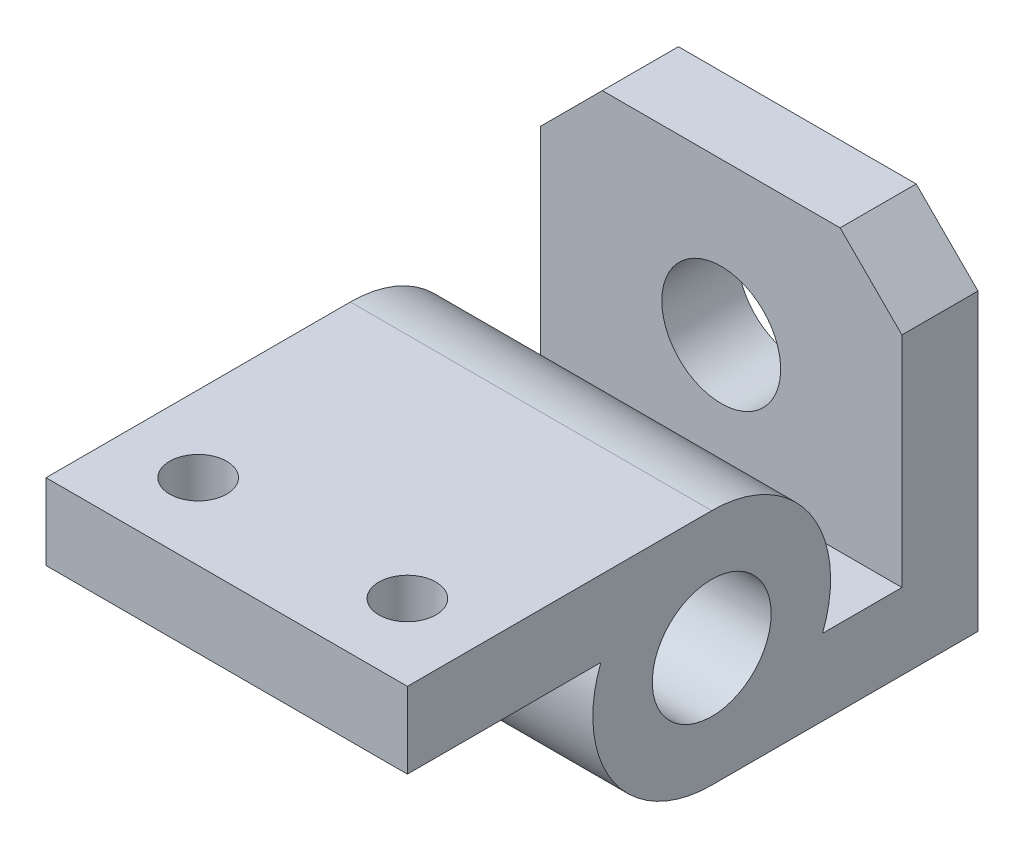
ISO-10303-21;
HEADER;
FILE_DESCRIPTION(('STEP AP214'),'2;1');
FILE_NAME('part.step','',(''),(''),'','','');
FILE_SCHEMA(('AUTOMOTIVE_DESIGN { 1 0 10303 214 1 1 1 1 }'));
ENDSEC;
DATA;
#1=APPLICATION_CONTEXT('core data for automotive mechanical design processes');
#2=APPLICATION_PROTOCOL_DEFINITION('international standard','automotive_design',2000,#1);
#3=PRODUCT_CONTEXT('',#1,'mechanical');
#4=PRODUCT('Part','Part','',(#3));
#5=PRODUCT_RELATED_PRODUCT_CATEGORY('part','',(#4));
#6=PRODUCT_DEFINITION_FORMATION('','',#4);
#7=PRODUCT_DEFINITION_CONTEXT('part definition',#1,'design');
#8=PRODUCT_DEFINITION('design','',#6,#7);
#9=PRODUCT_DEFINITION_SHAPE('','',#8);
#10=(LENGTH_UNIT() NAMED_UNIT(*) SI_UNIT(.MILLI.,.METRE.));
#11=(NAMED_UNIT(*) PLANE_ANGLE_UNIT() SI_UNIT($,.RADIAN.));
#12=(NAMED_UNIT(*) SI_UNIT($,.STERADIAN.) SOLID_ANGLE_UNIT());
#13=UNCERTAINTY_MEASURE_WITH_UNIT(LENGTH_MEASURE(1.E-05),#10,'distance_accuracy_value','');
#14=(GEOMETRIC_REPRESENTATION_CONTEXT(3) GLOBAL_UNCERTAINTY_ASSIGNED_CONTEXT((#13)) GLOBAL_UNIT_ASSIGNED_CONTEXT((#10,
#11,#12)) REPRESENTATION_CONTEXT('',''));
#15=CARTESIAN_POINT('',(0.,0.,0.));
#16=DIRECTION('',(0.,0.,1.));
#17=DIRECTION('',(1.,0.,0.));
#18=AXIS2_PLACEMENT_3D('',#15,#16,#17);
#19=CARTESIAN_POINT('',(38.,0.,0.));
#20=DIRECTION('',(1.,0.,0.));
#21=DIRECTION('',(0.,0.,-1.));
#22=AXIS2_PLACEMENT_3D('',#19,#20,#21);
#23=PLANE('',#22);
#24=DIRECTION('',(0.,1.,0.));
#25=VECTOR('',#24,1.);
#26=CARTESIAN_POINT('',(38.,-25.,-56.));
#27=LINE('',#26,#25);
#28=CARTESIAN_POINT('',(38.,-25.,-56.));
#29=VERTEX_POINT('',#28);
#30=CARTESIAN_POINT('',(38.,37.,-56.));
#31=VERTEX_POINT('',#30);
#32=EDGE_CURVE('E275',#29,#31,#27,.T.);
#33=ORIENTED_EDGE('',*,*,#32,.T.);
#34=DIRECTION('',(0.,0.,1.));
#35=VECTOR('',#34,1.);
#36=CARTESIAN_POINT('',(38.,36.9999999999999,-40.));
#37=LINE('',#36,#35);
#38=CARTESIAN_POINT('',(38.,36.9999999999999,-40.));
#39=VERTEX_POINT('',#38);
#40=EDGE_CURVE('E11',#31,#39,#37,.T.);
#41=ORIENTED_EDGE('',*,*,#40,.T.);
#42=DIRECTION('',(0.,-1.,0.));
#43=VECTOR('',#42,1.);
#44=CARTESIAN_POINT('',(38.,50.,-40.));
#45=LINE('',#44,#43);
#46=CARTESIAN_POINT('',(38.,-9.00000000000001,-40.));
#47=VERTEX_POINT('',#46);
#48=EDGE_CURVE('E278',#39,#47,#45,.T.);
#49=ORIENTED_EDGE('',*,*,#48,.T.);
#50=DIRECTION('',(0.,0.,1.));
#51=VECTOR('',#50,1.);
#52=CARTESIAN_POINT('',(38.,-9.00000000000001,-40.));
#53=LINE('',#52,#51);
#54=CARTESIAN_POINT('',(38.,-9.00000000000001,-23.3238075793812));
#55=VERTEX_POINT('',#54);
#56=EDGE_CURVE('E149',#47,#55,#53,.T.);
#57=ORIENTED_EDGE('',*,*,#56,.T.);
#58=CARTESIAN_POINT('',(38.,0.,0.));
#59=DIRECTION('',(1.,0.,0.));
#60=DIRECTION('',(0.,0.,-1.));
#61=AXIS2_PLACEMENT_3D('',#58,#59,#60);
#62=CIRCLE('',#61,25.);
#63=CARTESIAN_POINT('',(38.,25.,0.));
#64=VERTEX_POINT('',#63);
#65=EDGE_CURVE('E144',#55,#64,#62,.T.);
#66=ORIENTED_EDGE('',*,*,#65,.T.);
#67=DIRECTION('',(0.,0.,1.));
#68=VECTOR('',#67,1.);
#69=CARTESIAN_POINT('',(38.,25.,0.));
#70=LINE('',#69,#68);
#71=CARTESIAN_POINT('',(38.,25.,64.));
#72=VERTEX_POINT('',#71);
#73=EDGE_CURVE('E132',#64,#72,#70,.T.);
#74=ORIENTED_EDGE('',*,*,#73,.T.);
#75=DIRECTION('',(0.,-1.,0.));
#76=VECTOR('',#75,1.);
#77=CARTESIAN_POINT('',(38.,25.,64.));
#78=LINE('',#77,#76);
#79=CARTESIAN_POINT('',(38.,8.99999999999999,64.));
#80=VERTEX_POINT('',#79);
#81=EDGE_CURVE('E143',#72,#80,#78,.T.);
#82=ORIENTED_EDGE('',*,*,#81,.T.);
#83=DIRECTION('',(0.,0.,-1.));
#84=VECTOR('',#83,1.);
#85=CARTESIAN_POINT('',(38.,8.99999999999999,64.));
#86=LINE('',#85,#84);
#87=CARTESIAN_POINT('',(38.,8.99999999999999,23.3238075793812));
#88=VERTEX_POINT('',#87);
#89=EDGE_CURVE('E254',#80,#88,#86,.T.);
#90=ORIENTED_EDGE('',*,*,#89,.T.);
#91=CARTESIAN_POINT('',(38.,0.,0.));
#92=DIRECTION('',(1.,0.,0.));
#93=DIRECTION('',(0.,0.,-1.));
#94=AXIS2_PLACEMENT_3D('',#91,#92,#93);
#95=CIRCLE('',#94,25.);
#96=CARTESIAN_POINT('',(38.,-25.,0.));
#97=VERTEX_POINT('',#96);
#98=EDGE_CURVE('E284',#88,#97,#95,.T.);
#99=ORIENTED_EDGE('',*,*,#98,.T.);
#100=DIRECTION('',(0.,0.,-1.));
#101=VECTOR('',#100,1.);
#102=CARTESIAN_POINT('',(38.,-25.,0.));
#103=LINE('',#102,#101);
#104=EDGE_CURVE('E279',#97,#29,#103,.T.);
#105=ORIENTED_EDGE('',*,*,#104,.T.);
#106=EDGE_LOOP('',(#33,#41,#49,#57,#66,#74,#82,#90,#99,#105));
#107=FACE_BOUND('',#106,.T.);
#108=CARTESIAN_POINT('',(38.,0.,0.));
#109=DIRECTION('',(1.,0.,0.));
#110=DIRECTION('',(0.,0.,-1.));
#111=AXIS2_PLACEMENT_3D('',#108,#109,#110);
#112=CIRCLE('',#111,12.5);
#113=CARTESIAN_POINT('',(38.,0.,-12.5));
#114=VERTEX_POINT('',#113);
#115=EDGE_CURVE('E291',#114,#114,#112,.T.);
#116=ORIENTED_EDGE('',*,*,#115,.F.);
#117=EDGE_LOOP('',(#116));
#118=FACE_BOUND('',#117,.T.);
#119=ADVANCED_FACE('F38',(#107,#118),#23,.T.);
#120=CARTESIAN_POINT('',(-38.,0.,0.));
#121=DIRECTION('',(1.,0.,0.));
#122=DIRECTION('',(0.,0.,-1.));
#123=AXIS2_PLACEMENT_3D('',#120,#121,#122);
#124=PLANE('',#123);
#125=DIRECTION('',(0.,-1.,0.));
#126=VECTOR('',#125,1.);
#127=CARTESIAN_POINT('',(-38.,50.,-40.));
#128=LINE('',#127,#126);
#129=CARTESIAN_POINT('',(-38.,36.9999999999999,-40.));
#130=VERTEX_POINT('',#129);
#131=CARTESIAN_POINT('',(-38.,-9.00000000000001,-40.));
#132=VERTEX_POINT('',#131);
#133=EDGE_CURVE('E214',#130,#132,#128,.T.);
#134=ORIENTED_EDGE('',*,*,#133,.F.);
#135=DIRECTION('',(0.,0.,-1.));
#136=VECTOR('',#135,1.);
#137=CARTESIAN_POINT('',(-38.,36.9999999999999,0.));
#138=LINE('',#137,#136);
#139=CARTESIAN_POINT('',(-38.,36.9999999999999,-56.));
#140=VERTEX_POINT('',#139);
#141=EDGE_CURVE('E62',#130,#140,#138,.T.);
#142=ORIENTED_EDGE('',*,*,#141,.T.);
#143=DIRECTION('',(0.,1.,0.));
#144=VECTOR('',#143,1.);
#145=CARTESIAN_POINT('',(-38.,-25.,-56.));
#146=LINE('',#145,#144);
#147=CARTESIAN_POINT('',(-38.,-25.,-56.));
#148=VERTEX_POINT('',#147);
#149=EDGE_CURVE('E198',#148,#140,#146,.T.);
#150=ORIENTED_EDGE('',*,*,#149,.F.);
#151=DIRECTION('',(0.,0.,-1.));
#152=VECTOR('',#151,1.);
#153=CARTESIAN_POINT('',(-38.,-25.,0.));
#154=LINE('',#153,#152);
#155=CARTESIAN_POINT('',(-38.,-25.,0.));
#156=VERTEX_POINT('',#155);
#157=EDGE_CURVE('E224',#156,#148,#154,.T.);
#158=ORIENTED_EDGE('',*,*,#157,.F.);
#159=CARTESIAN_POINT('',(-38.,0.,0.));
#160=DIRECTION('',(1.,0.,0.));
#161=DIRECTION('',(0.,0.,-1.));
#162=AXIS2_PLACEMENT_3D('',#159,#160,#161);
#163=CIRCLE('',#162,25.);
#164=CARTESIAN_POINT('',(-38.,8.99999999999999,23.3238075793812));
#165=VERTEX_POINT('',#164);
#166=EDGE_CURVE('E260',#165,#156,#163,.T.);
#167=ORIENTED_EDGE('',*,*,#166,.F.);
#168=DIRECTION('',(0.,0.,-1.));
#169=VECTOR('',#168,1.);
#170=CARTESIAN_POINT('',(-38.,8.99999999999999,64.));
#171=LINE('',#170,#169);
#172=CARTESIAN_POINT('',(-38.,8.99999999999999,64.));
#173=VERTEX_POINT('',#172);
#174=EDGE_CURVE('E253',#173,#165,#171,.T.);
#175=ORIENTED_EDGE('',*,*,#174,.F.);
#176=DIRECTION('',(0.,-1.,0.));
#177=VECTOR('',#176,1.);
#178=CARTESIAN_POINT('',(-38.,25.,64.));
#179=LINE('',#178,#177);
#180=CARTESIAN_POINT('',(-38.,25.,64.));
#181=VERTEX_POINT('',#180);
#182=EDGE_CURVE('E258',#181,#173,#179,.T.);
#183=ORIENTED_EDGE('',*,*,#182,.F.);
#184=DIRECTION('',(0.,0.,1.));
#185=VECTOR('',#184,1.);
#186=CARTESIAN_POINT('',(-38.,25.,0.));
#187=LINE('',#186,#185);
#188=CARTESIAN_POINT('',(-38.,25.,0.));
#189=VERTEX_POINT('',#188);
#190=EDGE_CURVE('E266',#189,#181,#187,.T.);
#191=ORIENTED_EDGE('',*,*,#190,.F.);
#192=CARTESIAN_POINT('',(-38.,0.,0.));
#193=DIRECTION('',(1.,0.,0.));
#194=DIRECTION('',(0.,0.,-1.));
#195=AXIS2_PLACEMENT_3D('',#192,#193,#194);
#196=CIRCLE('',#195,25.);
#197=CARTESIAN_POINT('',(-38.,-9.00000000000001,-23.3238075793812));
#198=VERTEX_POINT('',#197);
#199=EDGE_CURVE('E158',#198,#189,#196,.T.);
#200=ORIENTED_EDGE('',*,*,#199,.F.);
#201=DIRECTION('',(0.,0.,1.));
#202=VECTOR('',#201,1.);
#203=CARTESIAN_POINT('',(-38.,-9.00000000000001,-40.));
#204=LINE('',#203,#202);
#205=EDGE_CURVE('E154',#132,#198,#204,.T.);
#206=ORIENTED_EDGE('',*,*,#205,.F.);
#207=EDGE_LOOP('',(#134,#142,#150,#158,#167,#175,#183,#191,#200,#206));
#208=FACE_BOUND('',#207,.T.);
#209=CARTESIAN_POINT('',(-38.,0.,0.));
#210=DIRECTION('',(1.,0.,0.));
#211=DIRECTION('',(0.,0.,-1.));
#212=AXIS2_PLACEMENT_3D('',#209,#210,#211);
#213=CIRCLE('',#212,12.5);
#214=CARTESIAN_POINT('',(-38.,0.,-12.5));
#215=VERTEX_POINT('',#214);
#216=EDGE_CURVE('E178',#215,#215,#213,.T.);
#217=ORIENTED_EDGE('',*,*,#216,.T.);
#218=EDGE_LOOP('',(#217));
#219=FACE_BOUND('',#218,.T.);
#220=ADVANCED_FACE('F217',(#208,#219),#124,.F.);
#221=CARTESIAN_POINT('',(38.,0.,0.));
#222=DIRECTION('',(-1.,0.,0.));
#223=DIRECTION('',(0.,0.,1.));
#224=AXIS2_PLACEMENT_3D('',#221,#222,#223);
#225=CYLINDRICAL_SURFACE('',#224,25.);
#226=ORIENTED_EDGE('',*,*,#199,.T.);
#227=DIRECTION('',(-1.,0.,0.));
#228=VECTOR('',#227,1.);
#229=CARTESIAN_POINT('',(38.,25.,0.));
#230=LINE('',#229,#228);
#231=EDGE_CURVE('E136',#64,#189,#230,.T.);
#232=ORIENTED_EDGE('',*,*,#231,.F.);
#233=ORIENTED_EDGE('',*,*,#65,.F.);
#234=DIRECTION('',(-1.,0.,0.));
#235=VECTOR('',#234,1.);
#236=CARTESIAN_POINT('',(38.,-9.00000000000001,-23.3238075793812));
#237=LINE('',#236,#235);
#238=EDGE_CURVE('E228',#55,#198,#237,.T.);
#239=ORIENTED_EDGE('',*,*,#238,.T.);
#240=EDGE_LOOP('',(#226,#232,#233,#239));
#241=FACE_BOUND('',#240,.T.);
#242=ADVANCED_FACE('F156',(#241),#225,.T.);
#243=CARTESIAN_POINT('',(38.,25.,0.));
#244=DIRECTION('',(0.,-1.,0.));
#245=DIRECTION('',(0.,0.,-1.));
#246=AXIS2_PLACEMENT_3D('',#243,#244,#245);
#247=PLANE('',#246);
#248=CARTESIAN_POINT('',(-22.,25.,48.));
#249=DIRECTION('',(0.,1.,0.));
#250=DIRECTION('',(0.,0.,1.));
#251=AXIS2_PLACEMENT_3D('',#248,#249,#250);
#252=CIRCLE('',#251,6.);
#253=CARTESIAN_POINT('',(-22.,25.,54.));
#254=VERTEX_POINT('',#253);
#255=EDGE_CURVE('E175',#254,#254,#252,.T.);
#256=ORIENTED_EDGE('',*,*,#255,.F.);
#257=EDGE_LOOP('',(#256));
#258=FACE_BOUND('',#257,.T.);
#259=CARTESIAN_POINT('',(22.,25.,48.));
#260=DIRECTION('',(0.,1.,0.));
#261=DIRECTION('',(0.,0.,1.));
#262=AXIS2_PLACEMENT_3D('',#259,#260,#261);
#263=CIRCLE('',#262,6.);
#264=CARTESIAN_POINT('',(22.,25.,54.));
#265=VERTEX_POINT('',#264);
#266=EDGE_CURVE('E343',#265,#265,#263,.T.);
#267=ORIENTED_EDGE('',*,*,#266,.F.);
#268=EDGE_LOOP('',(#267));
#269=FACE_BOUND('',#268,.T.);
#270=ORIENTED_EDGE('',*,*,#190,.T.);
#271=DIRECTION('',(-1.,0.,0.));
#272=VECTOR('',#271,1.);
#273=CARTESIAN_POINT('',(38.,25.,64.));
#274=LINE('',#273,#272);
#275=EDGE_CURVE('E139',#72,#181,#274,.T.);
#276=ORIENTED_EDGE('',*,*,#275,.F.);
#277=ORIENTED_EDGE('',*,*,#73,.F.);
#278=ORIENTED_EDGE('',*,*,#231,.T.);
#279=EDGE_LOOP('',(#270,#276,#277,#278));
#280=FACE_BOUND('',#279,.T.);
#281=ADVANCED_FACE('F134',(#258,#269,#280),#247,.F.);
#282=CARTESIAN_POINT('',(38.,25.,64.));
#283=DIRECTION('',(0.,0.,-1.));
#284=DIRECTION('',(-1.,0.,0.));
#285=AXIS2_PLACEMENT_3D('',#282,#283,#284);
#286=PLANE('',#285);
#287=ORIENTED_EDGE('',*,*,#182,.T.);
#288=DIRECTION('',(-1.,0.,0.));
#289=VECTOR('',#288,1.);
#290=CARTESIAN_POINT('',(38.,8.99999999999999,64.));
#291=LINE('',#290,#289);
#292=EDGE_CURVE('E166',#80,#173,#291,.T.);
#293=ORIENTED_EDGE('',*,*,#292,.F.);
#294=ORIENTED_EDGE('',*,*,#81,.F.);
#295=ORIENTED_EDGE('',*,*,#275,.T.);
#296=EDGE_LOOP('',(#287,#293,#294,#295));
#297=FACE_BOUND('',#296,.T.);
#298=ADVANCED_FACE('F293',(#297),#286,.F.);
#299=CARTESIAN_POINT('',(38.,8.99999999999999,64.));
#300=DIRECTION('',(0.,1.,0.));
#301=DIRECTION('',(0.,0.,1.));
#302=AXIS2_PLACEMENT_3D('',#299,#300,#301);
#303=PLANE('',#302);
#304=CARTESIAN_POINT('',(-22.,8.99999999999999,48.));
#305=DIRECTION('',(0.,1.,0.));
#306=DIRECTION('',(0.,0.,1.));
#307=AXIS2_PLACEMENT_3D('',#304,#305,#306);
#308=CIRCLE('',#307,6.);
#309=CARTESIAN_POINT('',(-22.,8.99999999999999,54.));
#310=VERTEX_POINT('',#309);
#311=EDGE_CURVE('E174',#310,#310,#308,.T.);
#312=ORIENTED_EDGE('',*,*,#311,.T.);
#313=EDGE_LOOP('',(#312));
#314=FACE_BOUND('',#313,.T.);
#315=CARTESIAN_POINT('',(22.,8.99999999999999,48.));
#316=DIRECTION('',(0.,1.,0.));
#317=DIRECTION('',(0.,0.,1.));
#318=AXIS2_PLACEMENT_3D('',#315,#316,#317);
#319=CIRCLE('',#318,6.);
#320=CARTESIAN_POINT('',(22.,8.99999999999999,54.));
#321=VERTEX_POINT('',#320);
#322=EDGE_CURVE('E170',#321,#321,#319,.T.);
#323=ORIENTED_EDGE('',*,*,#322,.T.);
#324=EDGE_LOOP('',(#323));
#325=FACE_BOUND('',#324,.T.);
#326=ORIENTED_EDGE('',*,*,#174,.T.);
#327=DIRECTION('',(-1.,0.,0.));
#328=VECTOR('',#327,1.);
#329=CARTESIAN_POINT('',(38.,8.99999999999999,23.3238075793812));
#330=LINE('',#329,#328);
#331=EDGE_CURVE('E242',#88,#165,#330,.T.);
#332=ORIENTED_EDGE('',*,*,#331,.F.);
#333=ORIENTED_EDGE('',*,*,#89,.F.);
#334=ORIENTED_EDGE('',*,*,#292,.T.);
#335=EDGE_LOOP('',(#326,#332,#333,#334));
#336=FACE_BOUND('',#335,.T.);
#337=ADVANCED_FACE('F251',(#314,#325,#336),#303,.F.);
#338=CARTESIAN_POINT('',(38.,0.,0.));
#339=DIRECTION('',(-1.,0.,0.));
#340=DIRECTION('',(0.,0.,1.));
#341=AXIS2_PLACEMENT_3D('',#338,#339,#340);
#342=CYLINDRICAL_SURFACE('',#341,25.);
#343=ORIENTED_EDGE('',*,*,#166,.T.);
#344=DIRECTION('',(-1.,0.,0.));
#345=VECTOR('',#344,1.);
#346=CARTESIAN_POINT('',(38.,-25.,0.));
#347=LINE('',#346,#345);
#348=EDGE_CURVE('E238',#97,#156,#347,.T.);
#349=ORIENTED_EDGE('',*,*,#348,.F.);
#350=ORIENTED_EDGE('',*,*,#98,.F.);
#351=ORIENTED_EDGE('',*,*,#331,.T.);
#352=EDGE_LOOP('',(#343,#349,#350,#351));
#353=FACE_BOUND('',#352,.T.);
#354=ADVANCED_FACE('F301',(#353),#342,.T.);
#355=CARTESIAN_POINT('',(38.,-25.,0.));
#356=DIRECTION('',(0.,1.,0.));
#357=DIRECTION('',(0.,0.,1.));
#358=AXIS2_PLACEMENT_3D('',#355,#356,#357);
#359=PLANE('',#358);
#360=ORIENTED_EDGE('',*,*,#157,.T.);
#361=DIRECTION('',(-1.,0.,0.));
#362=VECTOR('',#361,1.);
#363=CARTESIAN_POINT('',(38.,-25.,-56.));
#364=LINE('',#363,#362);
#365=EDGE_CURVE('E207',#29,#148,#364,.T.);
#366=ORIENTED_EDGE('',*,*,#365,.F.);
#367=ORIENTED_EDGE('',*,*,#104,.F.);
#368=ORIENTED_EDGE('',*,*,#348,.T.);
#369=EDGE_LOOP('',(#360,#366,#367,#368));
#370=FACE_BOUND('',#369,.T.);
#371=ADVANCED_FACE('F272',(#370),#359,.F.);
#372=CARTESIAN_POINT('',(38.,-25.,-56.));
#373=DIRECTION('',(0.,0.,1.));
#374=DIRECTION('',(1.,0.,0.));
#375=AXIS2_PLACEMENT_3D('',#372,#373,#374);
#376=PLANE('',#375);
#377=CARTESIAN_POINT('',(0.,18.,-56.));
#378=DIRECTION('',(0.,0.,-1.));
#379=DIRECTION('',(-1.,0.,0.));
#380=AXIS2_PLACEMENT_3D('',#377,#378,#379);
#381=CIRCLE('',#380,12.5);
#382=CARTESIAN_POINT('',(-12.5,18.,-56.));
#383=VERTEX_POINT('',#382);
#384=EDGE_CURVE('E336',#383,#383,#381,.T.);
#385=ORIENTED_EDGE('',*,*,#384,.F.);
#386=EDGE_LOOP('',(#385));
#387=FACE_BOUND('',#386,.T.);
#388=ORIENTED_EDGE('',*,*,#149,.T.);
#389=DIRECTION('',(-0.707106781186547,-0.707106781186548,0.));
#390=VECTOR('',#389,1.);
#391=CARTESIAN_POINT('',(-24.9999999999999,50.,-56.));
#392=LINE('',#391,#390);
#393=CARTESIAN_POINT('',(-24.9999999999999,50.,-56.));
#394=VERTEX_POINT('',#393);
#395=EDGE_CURVE('E47',#140,#394,#392,.F.);
#396=ORIENTED_EDGE('',*,*,#395,.T.);
#397=DIRECTION('',(-1.,0.,0.));
#398=VECTOR('',#397,1.);
#399=CARTESIAN_POINT('',(38.,50.,-56.));
#400=LINE('',#399,#398);
#401=CARTESIAN_POINT('',(25.,50.,-56.));
#402=VERTEX_POINT('',#401);
#403=EDGE_CURVE('E196',#402,#394,#400,.T.);
#404=ORIENTED_EDGE('',*,*,#403,.F.);
#405=DIRECTION('',(0.707106781186547,-0.707106781186548,0.));
#406=VECTOR('',#405,1.);
#407=CARTESIAN_POINT('',(38.,36.9999999999999,-56.));
#408=LINE('',#407,#406);
#409=EDGE_CURVE('E54',#402,#31,#408,.T.);
#410=ORIENTED_EDGE('',*,*,#409,.T.);
#411=ORIENTED_EDGE('',*,*,#32,.F.);
#412=ORIENTED_EDGE('',*,*,#365,.T.);
#413=EDGE_LOOP('',(#388,#396,#404,#410,#411,#412));
#414=FACE_BOUND('',#413,.T.);
#415=ADVANCED_FACE('F195',(#387,#414),#376,.F.);
#416=CARTESIAN_POINT('',(38.,50.,-56.));
#417=DIRECTION('',(0.,-1.,0.));
#418=DIRECTION('',(0.,0.,-1.));
#419=AXIS2_PLACEMENT_3D('',#416,#417,#418);
#420=PLANE('',#419);
#421=ORIENTED_EDGE('',*,*,#403,.T.);
#422=DIRECTION('',(0.,0.,1.));
#423=VECTOR('',#422,1.);
#424=CARTESIAN_POINT('',(-24.9999999999999,50.,-56.));
#425=LINE('',#424,#423);
#426=CARTESIAN_POINT('',(-24.9999999999999,50.,-40.));
#427=VERTEX_POINT('',#426);
#428=EDGE_CURVE('E164',#394,#427,#425,.T.);
#429=ORIENTED_EDGE('',*,*,#428,.T.);
#430=DIRECTION('',(-1.,0.,0.));
#431=VECTOR('',#430,1.);
#432=CARTESIAN_POINT('',(38.,50.,-40.));
#433=LINE('',#432,#431);
#434=CARTESIAN_POINT('',(25.,50.,-40.));
#435=VERTEX_POINT('',#434);
#436=EDGE_CURVE('E208',#435,#427,#433,.T.);
#437=ORIENTED_EDGE('',*,*,#436,.F.);
#438=DIRECTION('',(0.,0.,-1.));
#439=VECTOR('',#438,1.);
#440=CARTESIAN_POINT('',(25.,50.,-56.));
#441=LINE('',#440,#439);
#442=EDGE_CURVE('E160',#435,#402,#441,.T.);
#443=ORIENTED_EDGE('',*,*,#442,.T.);
#444=EDGE_LOOP('',(#421,#429,#437,#443));
#445=FACE_BOUND('',#444,.T.);
#446=ADVANCED_FACE('F202',(#445),#420,.F.);
#447=CARTESIAN_POINT('',(38.,50.,-40.));
#448=DIRECTION('',(0.,0.,-1.));
#449=DIRECTION('',(0.,1.,0.));
#450=AXIS2_PLACEMENT_3D('',#447,#448,#449);
#451=PLANE('',#450);
#452=CARTESIAN_POINT('',(0.,18.,-40.));
#453=DIRECTION('',(0.,0.,-1.));
#454=DIRECTION('',(0.,1.,0.));
#455=AXIS2_PLACEMENT_3D('',#452,#453,#454);
#456=CIRCLE('',#455,12.5);
#457=CARTESIAN_POINT('',(-12.5,18.,-40.));
#458=VERTEX_POINT('',#457);
#459=EDGE_CURVE('E339',#458,#458,#456,.F.);
#460=ORIENTED_EDGE('',*,*,#459,.F.);
#461=EDGE_LOOP('',(#460));
#462=FACE_BOUND('',#461,.T.);
#463=ORIENTED_EDGE('',*,*,#436,.T.);
#464=DIRECTION('',(0.707106781186547,0.707106781186548,0.));
#465=VECTOR('',#464,1.);
#466=CARTESIAN_POINT('',(-24.9999999999999,50.,-40.));
#467=LINE('',#466,#465);
#468=EDGE_CURVE('E186',#427,#130,#467,.F.);
#469=ORIENTED_EDGE('',*,*,#468,.T.);
#470=ORIENTED_EDGE('',*,*,#133,.T.);
#471=DIRECTION('',(-1.,0.,0.));
#472=VECTOR('',#471,1.);
#473=CARTESIAN_POINT('',(38.,-9.00000000000001,-40.));
#474=LINE('',#473,#472);
#475=EDGE_CURVE('E231',#47,#132,#474,.T.);
#476=ORIENTED_EDGE('',*,*,#475,.F.);
#477=ORIENTED_EDGE('',*,*,#48,.F.);
#478=DIRECTION('',(-0.707106781186547,0.707106781186548,0.));
#479=VECTOR('',#478,1.);
#480=CARTESIAN_POINT('',(38.,36.9999999999999,-40.));
#481=LINE('',#480,#479);
#482=EDGE_CURVE('E183',#39,#435,#481,.T.);
#483=ORIENTED_EDGE('',*,*,#482,.T.);
#484=EDGE_LOOP('',(#463,#469,#470,#476,#477,#483));
#485=FACE_BOUND('',#484,.T.);
#486=ADVANCED_FACE('F212',(#462,#485),#451,.F.);
#487=CARTESIAN_POINT('',(38.,-9.00000000000001,-40.));
#488=DIRECTION('',(0.,-1.,0.));
#489=DIRECTION('',(0.,0.,-1.));
#490=AXIS2_PLACEMENT_3D('',#487,#488,#489);
#491=PLANE('',#490);
#492=ORIENTED_EDGE('',*,*,#205,.T.);
#493=ORIENTED_EDGE('',*,*,#238,.F.);
#494=ORIENTED_EDGE('',*,*,#56,.F.);
#495=ORIENTED_EDGE('',*,*,#475,.T.);
#496=EDGE_LOOP('',(#492,#493,#494,#495));
#497=FACE_BOUND('',#496,.T.);
#498=ADVANCED_FACE('F321',(#497),#491,.F.);
#499=CARTESIAN_POINT('',(38.,0.,0.));
#500=DIRECTION('',(-1.,0.,0.));
#501=DIRECTION('',(0.,0.,1.));
#502=AXIS2_PLACEMENT_3D('',#499,#500,#501);
#503=CYLINDRICAL_SURFACE('',#502,12.5);
#504=ORIENTED_EDGE('',*,*,#115,.T.);
#505=EDGE_LOOP('',(#504));
#506=FACE_BOUND('',#505,.T.);
#507=ORIENTED_EDGE('',*,*,#216,.F.);
#508=EDGE_LOOP('',(#507));
#509=FACE_BOUND('',#508,.T.);
#510=ADVANCED_FACE('F318',(#506,#509),#503,.F.);
#511=CARTESIAN_POINT('',(22.,-51.,48.));
#512=DIRECTION('',(0.,1.,0.));
#513=DIRECTION('',(0.,0.,1.));
#514=AXIS2_PLACEMENT_3D('',#511,#512,#513);
#515=CYLINDRICAL_SURFACE('',#514,6.);
#516=ORIENTED_EDGE('',*,*,#266,.T.);
#517=EDGE_LOOP('',(#516));
#518=FACE_BOUND('',#517,.T.);
#519=ORIENTED_EDGE('',*,*,#322,.F.);
#520=EDGE_LOOP('',(#519));
#521=FACE_BOUND('',#520,.T.);
#522=ADVANCED_FACE('F360',(#518,#521),#515,.F.);
#523=CARTESIAN_POINT('',(-22.,-51.,48.));
#524=DIRECTION('',(0.,1.,0.));
#525=DIRECTION('',(0.,0.,1.));
#526=AXIS2_PLACEMENT_3D('',#523,#524,#525);
#527=CYLINDRICAL_SURFACE('',#526,6.);
#528=ORIENTED_EDGE('',*,*,#255,.T.);
#529=EDGE_LOOP('',(#528));
#530=FACE_BOUND('',#529,.T.);
#531=ORIENTED_EDGE('',*,*,#311,.F.);
#532=EDGE_LOOP('',(#531));
#533=FACE_BOUND('',#532,.T.);
#534=ADVANCED_FACE('F365',(#530,#533),#527,.F.);
#535=CARTESIAN_POINT('',(0.,18.,64.001));
#536=DIRECTION('',(0.,0.,-1.));
#537=DIRECTION('',(-1.,0.,0.));
#538=AXIS2_PLACEMENT_3D('',#535,#536,#537);
#539=CYLINDRICAL_SURFACE('',#538,12.5);
#540=CARTESIAN_POINT('',(-12.5,18.,-56.));
#541=CARTESIAN_POINT('',(-12.5,18.,-55.8333333333333));
#542=CARTESIAN_POINT('',(-12.5,18.,-55.6666666666667));
#543=CARTESIAN_POINT('',(-12.5,18.,-55.3333333333333));
#544=CARTESIAN_POINT('',(-12.5,18.,-55.1666666666667));
#545=CARTESIAN_POINT('',(-12.5,18.,-54.8333333333333));
#546=CARTESIAN_POINT('',(-12.5,18.,-54.6666666666667));
#547=CARTESIAN_POINT('',(-12.5,18.,-54.3333333333333));
#548=CARTESIAN_POINT('',(-12.5,18.,-54.1666666666667));
#549=CARTESIAN_POINT('',(-12.5,18.,-53.8333333333333));
#550=CARTESIAN_POINT('',(-12.5,18.,-53.6666666666667));
#551=CARTESIAN_POINT('',(-12.5,18.,-53.3333333333333));
#552=CARTESIAN_POINT('',(-12.5,18.,-53.1666666666667));
#553=CARTESIAN_POINT('',(-12.5,18.,-52.8333333333333));
#554=CARTESIAN_POINT('',(-12.5,18.,-52.6666666666667));
#555=CARTESIAN_POINT('',(-12.5,18.,-52.3333333333333));
#556=CARTESIAN_POINT('',(-12.5,18.,-52.1666666666667));
#557=CARTESIAN_POINT('',(-12.5,18.,-51.8333333333333));
#558=CARTESIAN_POINT('',(-12.5,18.,-51.6666666666667));
#559=CARTESIAN_POINT('',(-12.5,18.,-51.3333333333333));
#560=CARTESIAN_POINT('',(-12.5,18.,-51.1666666666667));
#561=CARTESIAN_POINT('',(-12.5,18.,-50.8333333333333));
#562=CARTESIAN_POINT('',(-12.5,18.,-50.6666666666667));
#563=CARTESIAN_POINT('',(-12.5,18.,-50.3333333333333));
#564=CARTESIAN_POINT('',(-12.5,18.,-50.1666666666667));
#565=CARTESIAN_POINT('',(-12.5,18.,-49.8333333333333));
#566=CARTESIAN_POINT('',(-12.5,18.,-49.6666666666667));
#567=CARTESIAN_POINT('',(-12.5,18.,-49.3333333333333));
#568=CARTESIAN_POINT('',(-12.5,18.,-49.1666666666667));
#569=CARTESIAN_POINT('',(-12.5,18.,-48.8333333333333));
#570=CARTESIAN_POINT('',(-12.5,18.,-48.6666666666667));
#571=CARTESIAN_POINT('',(-12.5,18.,-48.3333333333333));
#572=CARTESIAN_POINT('',(-12.5,18.,-48.1666666666667));
#573=CARTESIAN_POINT('',(-12.5,18.,-47.8333333333333));
#574=CARTESIAN_POINT('',(-12.5,18.,-47.6666666666667));
#575=CARTESIAN_POINT('',(-12.5,18.,-47.3333333333333));
#576=CARTESIAN_POINT('',(-12.5,18.,-47.1666666666667));
#577=CARTESIAN_POINT('',(-12.5,18.,-46.8333333333333));
#578=CARTESIAN_POINT('',(-12.5,18.,-46.6666666666667));
#579=CARTESIAN_POINT('',(-12.5,18.,-46.3333333333333));
#580=CARTESIAN_POINT('',(-12.5,18.,-46.1666666666667));
#581=CARTESIAN_POINT('',(-12.5,18.,-45.8333333333333));
#582=CARTESIAN_POINT('',(-12.5,18.,-45.6666666666667));
#583=CARTESIAN_POINT('',(-12.5,18.,-45.3333333333333));
#584=CARTESIAN_POINT('',(-12.5,18.,-45.1666666666667));
#585=CARTESIAN_POINT('',(-12.5,18.,-44.8333333333333));
#586=CARTESIAN_POINT('',(-12.5,18.,-44.6666666666667));
#587=CARTESIAN_POINT('',(-12.5,18.,-44.3333333333333));
#588=CARTESIAN_POINT('',(-12.5,18.,-44.1666666666667));
#589=CARTESIAN_POINT('',(-12.5,18.,-43.8333333333333));
#590=CARTESIAN_POINT('',(-12.5,18.,-43.6666666666667));
#591=CARTESIAN_POINT('',(-12.5,18.,-43.3333333333333));
#592=CARTESIAN_POINT('',(-12.5,18.,-43.1666666666667));
#593=CARTESIAN_POINT('',(-12.5,18.,-42.8333333333333));
#594=CARTESIAN_POINT('',(-12.5,18.,-42.6666666666667));
#595=CARTESIAN_POINT('',(-12.5,18.,-42.3333333333333));
#596=CARTESIAN_POINT('',(-12.5,18.,-42.1666666666667));
#597=CARTESIAN_POINT('',(-12.5,18.,-41.8333333333333));
#598=CARTESIAN_POINT('',(-12.5,18.,-41.6666666666667));
#599=CARTESIAN_POINT('',(-12.5,18.,-41.3333333333333));
#600=CARTESIAN_POINT('',(-12.5,18.,-41.1666666666667));
#601=CARTESIAN_POINT('',(-12.5,18.,-40.8333333333333));
#602=CARTESIAN_POINT('',(-12.5,18.,-40.6666666666667));
#603=CARTESIAN_POINT('',(-12.5,18.,-40.3333333333333));
#604=CARTESIAN_POINT('',(-12.5,18.,-40.1666666666667));
#605=CARTESIAN_POINT('',(-12.5,18.,-40.));
#606=B_SPLINE_CURVE_WITH_KNOTS('',3,(#540,#541,#542,#543,#544,#545,#546,#547,#548,#549,#550,
#551,#552,#553,#554,#555,#556,#557,#558,#559,#560,#561,#562,#563,#564,#565,#566,#567,#568,#569,
#570,#571,#572,#573,#574,#575,#576,#577,#578,#579,#580,#581,#582,#583,#584,#585,#586,#587,#588,
#589,#590,#591,#592,#593,#594,#595,#596,#597,#598,#599,#600,#601,#602,#603,#604,#605),
.UNSPECIFIED.,.F.,.F.,(4,2,2,2,2,2,2,2,2,2,2,2,2,2,2,2,2,2,2,2,2,2,2,2,2,2,2,2,2,2,2,2,4),(0.,
0.5,1.,1.5,2.,2.5,3.,3.5,4.,4.5,5.,5.50000000000001,6.00000000000001,6.50000000000001,
7.00000000000001,7.50000000000001,8.00000000000001,8.50000000000001,9.00000000000001,
9.50000000000001,10.,10.5,11.,11.5,12.,12.5,13.,13.5,14.,14.5,15.,15.5,16.),.UNSPECIFIED.);
#607=EDGE_CURVE('BSEAM371',#383,#458,#606,.T.);
#608=ORIENTED_EDGE('',*,*,#384,.T.);
#609=ORIENTED_EDGE('',*,*,#459,.T.);
#610=ORIENTED_EDGE('',*,*,#607,.T.);
#611=ORIENTED_EDGE('',*,*,#607,.F.);
#612=EDGE_LOOP('',(#608,#610,#609,#611));
#613=FACE_BOUND('',#612,.T.);
#614=ADVANCED_FACE('F371',(#613),#539,.F.);
#615=CARTESIAN_POINT('',(-24.9999999999999,50.,-56.));
#616=DIRECTION('',(0.707106781186548,-0.707106781186547,0.));
#617=DIRECTION('',(0.,0.,1.));
#618=AXIS2_PLACEMENT_3D('',#615,#616,#617);
#619=PLANE('',#618);
#620=ORIENTED_EDGE('',*,*,#395,.F.);
#621=ORIENTED_EDGE('',*,*,#141,.F.);
#622=ORIENTED_EDGE('',*,*,#468,.F.);
#623=ORIENTED_EDGE('',*,*,#428,.F.);
#624=EDGE_LOOP('',(#620,#621,#622,#623));
#625=FACE_BOUND('',#624,.T.);
#626=ADVANCED_FACE('F210',(#625),#619,.F.);
#627=CARTESIAN_POINT('',(38.,36.9999999999999,0.));
#628=DIRECTION('',(0.707106781186548,0.707106781186547,0.));
#629=DIRECTION('',(0.,0.,-1.));
#630=AXIS2_PLACEMENT_3D('',#627,#628,#629);
#631=PLANE('',#630);
#632=ORIENTED_EDGE('',*,*,#409,.F.);
#633=ORIENTED_EDGE('',*,*,#442,.F.);
#634=ORIENTED_EDGE('',*,*,#482,.F.);
#635=ORIENTED_EDGE('',*,*,#40,.F.);
#636=EDGE_LOOP('',(#632,#633,#634,#635));
#637=FACE_BOUND('',#636,.T.);
#638=ADVANCED_FACE('F40',(#637),#631,.T.);
#639=CLOSED_SHELL('',(#119,#220,#242,#281,#298,#337,#354,#371,#415,#446,#486,#498,#510,#522,
#534,#614,#626,#638));
#640=MANIFOLD_SOLID_BREP('B2',#639);
#641=ADVANCED_BREP_SHAPE_REPRESENTATION('',(#18,#640),#14);
#642=SHAPE_DEFINITION_REPRESENTATION(#9,#641);
ENDSEC;
END-ISO-10303-21;
